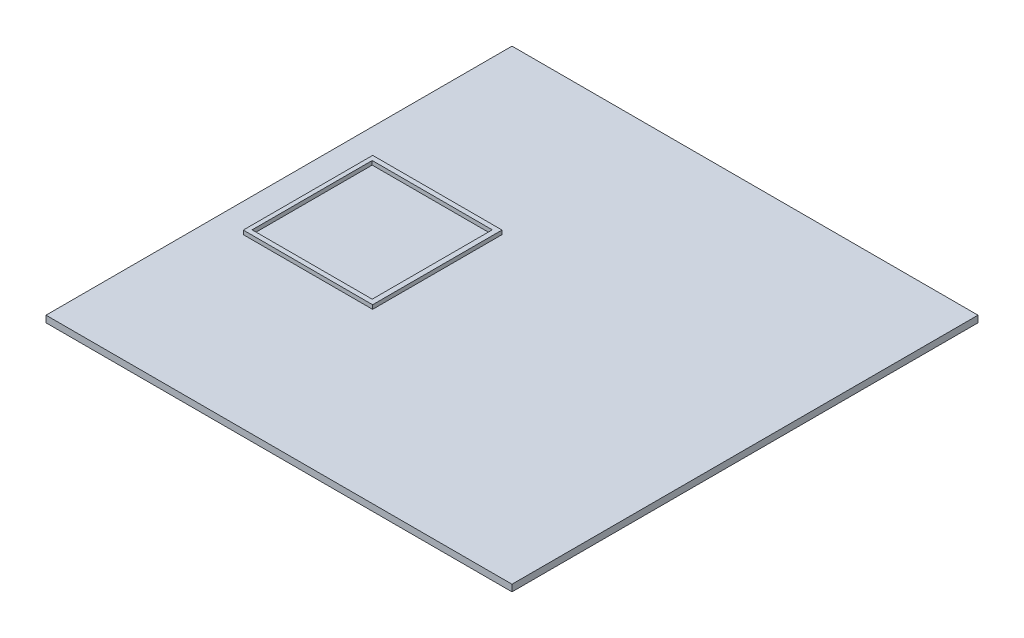
ISO-10303-21;
HEADER;
FILE_DESCRIPTION(('STEP AP214'),'2;1');
FILE_NAME('part.step','',(''),(''),'','','');
FILE_SCHEMA(('AUTOMOTIVE_DESIGN { 1 0 10303 214 1 1 1 1 }'));
ENDSEC;
DATA;
#1=APPLICATION_CONTEXT('core data for automotive mechanical design processes');
#2=APPLICATION_PROTOCOL_DEFINITION('international standard','automotive_design',2000,#1);
#3=PRODUCT_CONTEXT('',#1,'mechanical');
#4=PRODUCT('Part','Part','',(#3));
#5=PRODUCT_RELATED_PRODUCT_CATEGORY('part','',(#4));
#6=PRODUCT_DEFINITION_FORMATION('','',#4);
#7=PRODUCT_DEFINITION_CONTEXT('part definition',#1,'design');
#8=PRODUCT_DEFINITION('design','',#6,#7);
#9=PRODUCT_DEFINITION_SHAPE('','',#8);
#10=(LENGTH_UNIT() NAMED_UNIT(*) SI_UNIT(.MILLI.,.METRE.));
#11=(NAMED_UNIT(*) PLANE_ANGLE_UNIT() SI_UNIT($,.RADIAN.));
#12=(NAMED_UNIT(*) SI_UNIT($,.STERADIAN.) SOLID_ANGLE_UNIT());
#13=UNCERTAINTY_MEASURE_WITH_UNIT(LENGTH_MEASURE(1.E-05),#10,'distance_accuracy_value','');
#14=(GEOMETRIC_REPRESENTATION_CONTEXT(3) GLOBAL_UNCERTAINTY_ASSIGNED_CONTEXT((#13)) GLOBAL_UNIT_ASSIGNED_CONTEXT((#10,
#11,#12)) REPRESENTATION_CONTEXT('',''));
#15=CARTESIAN_POINT('',(0.,0.,0.));
#16=DIRECTION('',(0.,0.,1.));
#17=DIRECTION('',(1.,0.,0.));
#18=AXIS2_PLACEMENT_3D('',#15,#16,#17);
#19=CARTESIAN_POINT('',(0.,5.,0.));
#20=DIRECTION('',(0.,1.,0.));
#21=DIRECTION('',(0.,0.,1.));
#22=AXIS2_PLACEMENT_3D('',#19,#20,#21);
#23=PLANE('',#22);
#24=DIRECTION('',(0.,0.,-1.));
#25=VECTOR('',#24,1.);
#26=CARTESIAN_POINT('',(175.,5.,-175.));
#27=LINE('',#26,#25);
#28=CARTESIAN_POINT('',(175.,5.,175.));
#29=VERTEX_POINT('',#28);
#30=CARTESIAN_POINT('',(175.,5.,-175.));
#31=VERTEX_POINT('',#30);
#32=EDGE_CURVE('E193',#29,#31,#27,.T.);
#33=ORIENTED_EDGE('',*,*,#32,.T.);
#34=DIRECTION('',(-1.,0.,0.));
#35=VECTOR('',#34,1.);
#36=CARTESIAN_POINT('',(-175.,5.,-175.));
#37=LINE('',#36,#35);
#38=CARTESIAN_POINT('',(-175.,5.,-175.));
#39=VERTEX_POINT('',#38);
#40=EDGE_CURVE('E196',#31,#39,#37,.T.);
#41=ORIENTED_EDGE('',*,*,#40,.T.);
#42=DIRECTION('',(0.,0.,1.));
#43=VECTOR('',#42,1.);
#44=CARTESIAN_POINT('',(-175.,5.,-175.));
#45=LINE('',#44,#43);
#46=CARTESIAN_POINT('',(-175.,5.,175.));
#47=VERTEX_POINT('',#46);
#48=EDGE_CURVE('E199',#39,#47,#45,.T.);
#49=ORIENTED_EDGE('',*,*,#48,.T.);
#50=DIRECTION('',(1.,0.,0.));
#51=VECTOR('',#50,1.);
#52=CARTESIAN_POINT('',(-175.,5.,175.));
#53=LINE('',#52,#51);
#54=EDGE_CURVE('E201',#47,#29,#53,.T.);
#55=ORIENTED_EDGE('',*,*,#54,.T.);
#56=EDGE_LOOP('',(#33,#41,#49,#55));
#57=FACE_BOUND('',#56,.T.);
#58=DIRECTION('',(0.,0.,1.));
#59=VECTOR('',#58,1.);
#60=CARTESIAN_POINT('',(-153.264875211768,5.,45.1));
#61=LINE('',#60,#59);
#62=CARTESIAN_POINT('',(-153.264875211768,5.,-48.6228033719769));
#63=VERTEX_POINT('',#62);
#64=CARTESIAN_POINT('',(-153.264875211768,5.,48.5575172830579));
#65=VERTEX_POINT('',#64);
#66=EDGE_CURVE('E178',#63,#65,#61,.T.);
#67=ORIENTED_EDGE('',*,*,#66,.F.);
#68=DIRECTION('',(-1.,0.,0.));
#69=VECTOR('',#68,1.);
#70=CARTESIAN_POINT('',(-153.264875211768,5.,-48.6228033719769));
#71=LINE('',#70,#69);
#72=CARTESIAN_POINT('',(-56.1212085121312,5.,-48.6228033719769));
#73=VERTEX_POINT('',#72);
#74=EDGE_CURVE('E145',#73,#63,#71,.T.);
#75=ORIENTED_EDGE('',*,*,#74,.F.);
#76=DIRECTION('',(0.,0.,-1.));
#77=VECTOR('',#76,1.);
#78=CARTESIAN_POINT('',(-56.1212085121312,5.,-45.1));
#79=LINE('',#78,#77);
#80=CARTESIAN_POINT('',(-56.1212085121312,5.,48.5575172830579));
#81=VERTEX_POINT('',#80);
#82=EDGE_CURVE('E170',#81,#73,#79,.T.);
#83=ORIENTED_EDGE('',*,*,#82,.F.);
#84=DIRECTION('',(1.,0.,0.));
#85=VECTOR('',#84,1.);
#86=CARTESIAN_POINT('',(-59.9,5.,48.5575172830579));
#87=LINE('',#86,#85);
#88=EDGE_CURVE('E180',#65,#81,#87,.T.);
#89=ORIENTED_EDGE('',*,*,#88,.F.);
#90=EDGE_LOOP('',(#67,#75,#83,#89));
#91=FACE_BOUND('',#90,.T.);
#92=ADVANCED_FACE('F37',(#57,#91),#23,.T.);
#93=CARTESIAN_POINT('',(175.,5.,-175.));
#94=DIRECTION('',(-1.,0.,0.));
#95=DIRECTION('',(0.,0.,1.));
#96=AXIS2_PLACEMENT_3D('',#93,#94,#95);
#97=PLANE('',#96);
#98=DIRECTION('',(0.,0.,-1.));
#99=VECTOR('',#98,1.);
#100=CARTESIAN_POINT('',(175.,0.,-175.));
#101=LINE('',#100,#99);
#102=CARTESIAN_POINT('',(175.,0.,175.));
#103=VERTEX_POINT('',#102);
#104=CARTESIAN_POINT('',(175.,0.,-175.));
#105=VERTEX_POINT('',#104);
#106=EDGE_CURVE('E192',#103,#105,#101,.T.);
#107=ORIENTED_EDGE('',*,*,#106,.T.);
#108=DIRECTION('',(0.,-1.,0.));
#109=VECTOR('',#108,1.);
#110=CARTESIAN_POINT('',(175.,5.,-175.));
#111=LINE('',#110,#109);
#112=EDGE_CURVE('E11',#31,#105,#111,.T.);
#113=ORIENTED_EDGE('',*,*,#112,.F.);
#114=ORIENTED_EDGE('',*,*,#32,.F.);
#115=DIRECTION('',(0.,-1.,0.));
#116=VECTOR('',#115,1.);
#117=CARTESIAN_POINT('',(175.,5.,175.));
#118=LINE('',#117,#116);
#119=EDGE_CURVE('E203',#29,#103,#118,.T.);
#120=ORIENTED_EDGE('',*,*,#119,.T.);
#121=EDGE_LOOP('',(#107,#113,#114,#120));
#122=FACE_BOUND('',#121,.T.);
#123=ADVANCED_FACE('F39',(#122),#97,.F.);
#124=CARTESIAN_POINT('',(-175.,5.,-175.));
#125=DIRECTION('',(0.,0.,1.));
#126=DIRECTION('',(1.,0.,0.));
#127=AXIS2_PLACEMENT_3D('',#124,#125,#126);
#128=PLANE('',#127);
#129=DIRECTION('',(-1.,0.,0.));
#130=VECTOR('',#129,1.);
#131=CARTESIAN_POINT('',(-175.,0.,-175.));
#132=LINE('',#131,#130);
#133=CARTESIAN_POINT('',(-175.,0.,-175.));
#134=VERTEX_POINT('',#133);
#135=EDGE_CURVE('E206',#105,#134,#132,.T.);
#136=ORIENTED_EDGE('',*,*,#135,.T.);
#137=DIRECTION('',(0.,-1.,0.));
#138=VECTOR('',#137,1.);
#139=CARTESIAN_POINT('',(-175.,5.,-175.));
#140=LINE('',#139,#138);
#141=EDGE_CURVE('E45',#39,#134,#140,.T.);
#142=ORIENTED_EDGE('',*,*,#141,.F.);
#143=ORIENTED_EDGE('',*,*,#40,.F.);
#144=ORIENTED_EDGE('',*,*,#112,.T.);
#145=EDGE_LOOP('',(#136,#142,#143,#144));
#146=FACE_BOUND('',#145,.T.);
#147=ADVANCED_FACE('F236',(#146),#128,.F.);
#148=CARTESIAN_POINT('',(-175.,5.,-175.));
#149=DIRECTION('',(1.,0.,0.));
#150=DIRECTION('',(0.,0.,-1.));
#151=AXIS2_PLACEMENT_3D('',#148,#149,#150);
#152=PLANE('',#151);
#153=DIRECTION('',(0.,0.,1.));
#154=VECTOR('',#153,1.);
#155=CARTESIAN_POINT('',(-175.,0.,-175.));
#156=LINE('',#155,#154);
#157=CARTESIAN_POINT('',(-175.,0.,175.));
#158=VERTEX_POINT('',#157);
#159=EDGE_CURVE('E208',#134,#158,#156,.T.);
#160=ORIENTED_EDGE('',*,*,#159,.T.);
#161=DIRECTION('',(0.,-1.,0.));
#162=VECTOR('',#161,1.);
#163=CARTESIAN_POINT('',(-175.,5.,175.));
#164=LINE('',#163,#162);
#165=EDGE_CURVE('E213',#47,#158,#164,.T.);
#166=ORIENTED_EDGE('',*,*,#165,.F.);
#167=ORIENTED_EDGE('',*,*,#48,.F.);
#168=ORIENTED_EDGE('',*,*,#141,.T.);
#169=EDGE_LOOP('',(#160,#166,#167,#168));
#170=FACE_BOUND('',#169,.T.);
#171=ADVANCED_FACE('F220',(#170),#152,.F.);
#172=CARTESIAN_POINT('',(-175.,5.,175.));
#173=DIRECTION('',(0.,0.,-1.));
#174=DIRECTION('',(-1.,0.,0.));
#175=AXIS2_PLACEMENT_3D('',#172,#173,#174);
#176=PLANE('',#175);
#177=DIRECTION('',(1.,0.,0.));
#178=VECTOR('',#177,1.);
#179=CARTESIAN_POINT('',(-175.,0.,175.));
#180=LINE('',#179,#178);
#181=EDGE_CURVE('E197',#158,#103,#180,.T.);
#182=ORIENTED_EDGE('',*,*,#181,.T.);
#183=ORIENTED_EDGE('',*,*,#119,.F.);
#184=ORIENTED_EDGE('',*,*,#54,.F.);
#185=ORIENTED_EDGE('',*,*,#165,.T.);
#186=EDGE_LOOP('',(#182,#183,#184,#185));
#187=FACE_BOUND('',#186,.T.);
#188=ADVANCED_FACE('F229',(#187),#176,.F.);
#189=CARTESIAN_POINT('',(0.,0.,0.));
#190=DIRECTION('',(0.,1.,0.));
#191=DIRECTION('',(0.,0.,1.));
#192=AXIS2_PLACEMENT_3D('',#189,#190,#191);
#193=PLANE('',#192);
#194=ORIENTED_EDGE('',*,*,#106,.F.);
#195=ORIENTED_EDGE('',*,*,#181,.F.);
#196=ORIENTED_EDGE('',*,*,#159,.F.);
#197=ORIENTED_EDGE('',*,*,#135,.F.);
#198=EDGE_LOOP('',(#194,#195,#196,#197));
#199=FACE_BOUND('',#198,.T.);
#200=ADVANCED_FACE('F226',(#199),#193,.F.);
#201=CARTESIAN_POINT('',(0.,8.,0.));
#202=DIRECTION('',(0.,-1.,0.));
#203=DIRECTION('',(0.,0.,-1.));
#204=AXIS2_PLACEMENT_3D('',#201,#202,#203);
#205=PLANE('',#204);
#206=DIRECTION('',(-1.,0.,0.));
#207=VECTOR('',#206,1.);
#208=CARTESIAN_POINT('',(-56.1212085121312,8.,-48.6228033719769));
#209=LINE('',#208,#207);
#210=CARTESIAN_POINT('',(-56.1212085121312,8.,-48.6228033719769));
#211=VERTEX_POINT('',#210);
#212=CARTESIAN_POINT('',(-153.264875211768,8.,-48.6228033719769));
#213=VERTEX_POINT('',#212);
#214=EDGE_CURVE('E167',#211,#213,#209,.T.);
#215=ORIENTED_EDGE('',*,*,#214,.T.);
#216=DIRECTION('',(0.,0.,1.));
#217=VECTOR('',#216,1.);
#218=CARTESIAN_POINT('',(-153.264875211768,8.,-45.1));
#219=LINE('',#218,#217);
#220=CARTESIAN_POINT('',(-153.264875211768,8.,48.5575172830579));
#221=VERTEX_POINT('',#220);
#222=EDGE_CURVE('E169',#213,#221,#219,.T.);
#223=ORIENTED_EDGE('',*,*,#222,.T.);
#224=DIRECTION('',(1.,0.,0.));
#225=VECTOR('',#224,1.);
#226=CARTESIAN_POINT('',(-153.264875211768,8.,48.5575172830579));
#227=LINE('',#226,#225);
#228=CARTESIAN_POINT('',(-56.1212085121312,8.,48.5575172830579));
#229=VERTEX_POINT('',#228);
#230=EDGE_CURVE('E172',#221,#229,#227,.T.);
#231=ORIENTED_EDGE('',*,*,#230,.T.);
#232=DIRECTION('',(0.,0.,-1.));
#233=VECTOR('',#232,1.);
#234=CARTESIAN_POINT('',(-56.1212085121312,8.,48.5575172830579));
#235=LINE('',#234,#233);
#236=EDGE_CURVE('E174',#229,#211,#235,.T.);
#237=ORIENTED_EDGE('',*,*,#236,.T.);
#238=EDGE_LOOP('',(#215,#223,#231,#237));
#239=FACE_BOUND('',#238,.T.);
#240=DIRECTION('',(0.,0.,-1.));
#241=VECTOR('',#240,1.);
#242=CARTESIAN_POINT('',(-59.9,8.,-45.1));
#243=LINE('',#242,#241);
#244=CARTESIAN_POINT('',(-59.9,8.,45.1));
#245=VERTEX_POINT('',#244);
#246=CARTESIAN_POINT('',(-59.9,8.,-45.1));
#247=VERTEX_POINT('',#246);
#248=EDGE_CURVE('E128',#245,#247,#243,.T.);
#249=ORIENTED_EDGE('',*,*,#248,.F.);
#250=DIRECTION('',(1.,0.,0.));
#251=VECTOR('',#250,1.);
#252=CARTESIAN_POINT('',(-150.1,8.,45.1));
#253=LINE('',#252,#251);
#254=CARTESIAN_POINT('',(-150.1,8.,45.1));
#255=VERTEX_POINT('',#254);
#256=EDGE_CURVE('E153',#255,#245,#253,.T.);
#257=ORIENTED_EDGE('',*,*,#256,.F.);
#258=DIRECTION('',(0.,0.,1.));
#259=VECTOR('',#258,1.);
#260=CARTESIAN_POINT('',(-150.1,8.,-45.1));
#261=LINE('',#260,#259);
#262=CARTESIAN_POINT('',(-150.1,8.,-45.1));
#263=VERTEX_POINT('',#262);
#264=EDGE_CURVE('E151',#263,#255,#261,.T.);
#265=ORIENTED_EDGE('',*,*,#264,.F.);
#266=DIRECTION('',(-1.,0.,0.));
#267=VECTOR('',#266,1.);
#268=CARTESIAN_POINT('',(-150.1,8.,-45.1));
#269=LINE('',#268,#267);
#270=EDGE_CURVE('E137',#247,#263,#269,.T.);
#271=ORIENTED_EDGE('',*,*,#270,.F.);
#272=EDGE_LOOP('',(#249,#257,#265,#271));
#273=FACE_BOUND('',#272,.T.);
#274=ADVANCED_FACE('F149',(#239,#273),#205,.F.);
#275=CARTESIAN_POINT('',(-153.264875211768,8.,-48.6228033719769));
#276=DIRECTION('',(0.,0.,1.));
#277=DIRECTION('',(1.,0.,0.));
#278=AXIS2_PLACEMENT_3D('',#275,#276,#277);
#279=PLANE('',#278);
#280=ORIENTED_EDGE('',*,*,#74,.T.);
#281=DIRECTION('',(0.,-1.,0.));
#282=VECTOR('',#281,1.);
#283=CARTESIAN_POINT('',(-153.264875211768,8.,-48.6228033719769));
#284=LINE('',#283,#282);
#285=EDGE_CURVE('E189',#213,#63,#284,.T.);
#286=ORIENTED_EDGE('',*,*,#285,.F.);
#287=ORIENTED_EDGE('',*,*,#214,.F.);
#288=DIRECTION('',(0.,-1.,0.));
#289=VECTOR('',#288,1.);
#290=CARTESIAN_POINT('',(-56.1212085121312,8.,-48.6228033719769));
#291=LINE('',#290,#289);
#292=EDGE_CURVE('E176',#211,#73,#291,.T.);
#293=ORIENTED_EDGE('',*,*,#292,.T.);
#294=EDGE_LOOP('',(#280,#286,#287,#293));
#295=FACE_BOUND('',#294,.T.);
#296=ADVANCED_FACE('F272',(#295),#279,.F.);
#297=CARTESIAN_POINT('',(-153.264875211768,8.,45.1));
#298=DIRECTION('',(1.,0.,0.));
#299=DIRECTION('',(0.,0.,-1.));
#300=AXIS2_PLACEMENT_3D('',#297,#298,#299);
#301=PLANE('',#300);
#302=ORIENTED_EDGE('',*,*,#66,.T.);
#303=DIRECTION('',(0.,-1.,0.));
#304=VECTOR('',#303,1.);
#305=CARTESIAN_POINT('',(-153.264875211768,8.,48.5575172830579));
#306=LINE('',#305,#304);
#307=EDGE_CURVE('E186',#221,#65,#306,.T.);
#308=ORIENTED_EDGE('',*,*,#307,.F.);
#309=ORIENTED_EDGE('',*,*,#222,.F.);
#310=ORIENTED_EDGE('',*,*,#285,.T.);
#311=EDGE_LOOP('',(#302,#308,#309,#310));
#312=FACE_BOUND('',#311,.T.);
#313=ADVANCED_FACE('F279',(#312),#301,.F.);
#314=CARTESIAN_POINT('',(-59.9,8.,48.5575172830579));
#315=DIRECTION('',(0.,0.,-1.));
#316=DIRECTION('',(-1.,0.,0.));
#317=AXIS2_PLACEMENT_3D('',#314,#315,#316);
#318=PLANE('',#317);
#319=ORIENTED_EDGE('',*,*,#88,.T.);
#320=DIRECTION('',(0.,-1.,0.));
#321=VECTOR('',#320,1.);
#322=CARTESIAN_POINT('',(-56.1212085121312,8.,48.5575172830579));
#323=LINE('',#322,#321);
#324=EDGE_CURVE('E52',#229,#81,#323,.T.);
#325=ORIENTED_EDGE('',*,*,#324,.F.);
#326=ORIENTED_EDGE('',*,*,#230,.F.);
#327=ORIENTED_EDGE('',*,*,#307,.T.);
#328=EDGE_LOOP('',(#319,#325,#326,#327));
#329=FACE_BOUND('',#328,.T.);
#330=ADVANCED_FACE('F276',(#329),#318,.F.);
#331=CARTESIAN_POINT('',(-56.1212085121312,8.,-45.1));
#332=DIRECTION('',(-1.,0.,0.));
#333=DIRECTION('',(0.,0.,1.));
#334=AXIS2_PLACEMENT_3D('',#331,#332,#333);
#335=PLANE('',#334);
#336=ORIENTED_EDGE('',*,*,#82,.T.);
#337=ORIENTED_EDGE('',*,*,#292,.F.);
#338=ORIENTED_EDGE('',*,*,#236,.F.);
#339=ORIENTED_EDGE('',*,*,#324,.T.);
#340=EDGE_LOOP('',(#336,#337,#338,#339));
#341=FACE_BOUND('',#340,.T.);
#342=ADVANCED_FACE('F269',(#341),#335,.F.);
#343=CARTESIAN_POINT('',(-59.9,8.,-45.1));
#344=DIRECTION('',(-1.,0.,0.));
#345=DIRECTION('',(0.,0.,1.));
#346=AXIS2_PLACEMENT_3D('',#343,#344,#345);
#347=PLANE('',#346);
#348=DIRECTION('',(0.,0.,-1.));
#349=VECTOR('',#348,1.);
#350=CARTESIAN_POINT('',(-59.9,5.,-45.1));
#351=LINE('',#350,#349);
#352=CARTESIAN_POINT('',(-59.9,5.,45.1));
#353=VERTEX_POINT('',#352);
#354=CARTESIAN_POINT('',(-59.9,5.,-45.1));
#355=VERTEX_POINT('',#354);
#356=EDGE_CURVE('E60',#353,#355,#351,.T.);
#357=ORIENTED_EDGE('',*,*,#356,.F.);
#358=DIRECTION('',(0.,-1.,0.));
#359=VECTOR('',#358,1.);
#360=CARTESIAN_POINT('',(-59.9,8.,45.1));
#361=LINE('',#360,#359);
#362=EDGE_CURVE('E133',#245,#353,#361,.T.);
#363=ORIENTED_EDGE('',*,*,#362,.F.);
#364=ORIENTED_EDGE('',*,*,#248,.T.);
#365=DIRECTION('',(0.,-1.,0.));
#366=VECTOR('',#365,1.);
#367=CARTESIAN_POINT('',(-59.9,8.,-45.1));
#368=LINE('',#367,#366);
#369=EDGE_CURVE('E131',#247,#355,#368,.T.);
#370=ORIENTED_EDGE('',*,*,#369,.T.);
#371=EDGE_LOOP('',(#357,#363,#364,#370));
#372=FACE_BOUND('',#371,.T.);
#373=ADVANCED_FACE('F130',(#372),#347,.T.);
#374=CARTESIAN_POINT('',(-150.1,8.,-45.1));
#375=DIRECTION('',(0.,0.,1.));
#376=DIRECTION('',(1.,0.,0.));
#377=AXIS2_PLACEMENT_3D('',#374,#375,#376);
#378=PLANE('',#377);
#379=DIRECTION('',(-1.,0.,0.));
#380=VECTOR('',#379,1.);
#381=CARTESIAN_POINT('',(-150.1,5.,-45.1));
#382=LINE('',#381,#380);
#383=CARTESIAN_POINT('',(-150.1,5.,-45.1));
#384=VERTEX_POINT('',#383);
#385=EDGE_CURVE('E144',#355,#384,#382,.T.);
#386=ORIENTED_EDGE('',*,*,#385,.F.);
#387=ORIENTED_EDGE('',*,*,#369,.F.);
#388=ORIENTED_EDGE('',*,*,#270,.T.);
#389=DIRECTION('',(0.,-1.,0.));
#390=VECTOR('',#389,1.);
#391=CARTESIAN_POINT('',(-150.1,8.,-45.1));
#392=LINE('',#391,#390);
#393=EDGE_CURVE('E146',#263,#384,#392,.T.);
#394=ORIENTED_EDGE('',*,*,#393,.T.);
#395=EDGE_LOOP('',(#386,#387,#388,#394));
#396=FACE_BOUND('',#395,.T.);
#397=ADVANCED_FACE('F141',(#396),#378,.T.);
#398=CARTESIAN_POINT('',(-150.1,8.,-45.1));
#399=DIRECTION('',(1.,0.,0.));
#400=DIRECTION('',(0.,0.,-1.));
#401=AXIS2_PLACEMENT_3D('',#398,#399,#400);
#402=PLANE('',#401);
#403=DIRECTION('',(0.,0.,1.));
#404=VECTOR('',#403,1.);
#405=CARTESIAN_POINT('',(-150.1,5.,-45.1));
#406=LINE('',#405,#404);
#407=CARTESIAN_POINT('',(-150.1,5.,45.1));
#408=VERTEX_POINT('',#407);
#409=EDGE_CURVE('E159',#384,#408,#406,.T.);
#410=ORIENTED_EDGE('',*,*,#409,.F.);
#411=ORIENTED_EDGE('',*,*,#393,.F.);
#412=ORIENTED_EDGE('',*,*,#264,.T.);
#413=DIRECTION('',(0.,-1.,0.));
#414=VECTOR('',#413,1.);
#415=CARTESIAN_POINT('',(-150.1,8.,45.1));
#416=LINE('',#415,#414);
#417=EDGE_CURVE('E163',#255,#408,#416,.T.);
#418=ORIENTED_EDGE('',*,*,#417,.T.);
#419=EDGE_LOOP('',(#410,#411,#412,#418));
#420=FACE_BOUND('',#419,.T.);
#421=ADVANCED_FACE('F255',(#420),#402,.T.);
#422=CARTESIAN_POINT('',(-150.1,8.,45.1));
#423=DIRECTION('',(0.,0.,-1.));
#424=DIRECTION('',(-1.,0.,0.));
#425=AXIS2_PLACEMENT_3D('',#422,#423,#424);
#426=PLANE('',#425);
#427=DIRECTION('',(1.,0.,0.));
#428=VECTOR('',#427,1.);
#429=CARTESIAN_POINT('',(-150.1,5.,45.1));
#430=LINE('',#429,#428);
#431=EDGE_CURVE('E138',#408,#353,#430,.T.);
#432=ORIENTED_EDGE('',*,*,#431,.F.);
#433=ORIENTED_EDGE('',*,*,#417,.F.);
#434=ORIENTED_EDGE('',*,*,#256,.T.);
#435=ORIENTED_EDGE('',*,*,#362,.T.);
#436=EDGE_LOOP('',(#432,#433,#434,#435));
#437=FACE_BOUND('',#436,.T.);
#438=ADVANCED_FACE('F251',(#437),#426,.T.);
#439=ORIENTED_EDGE('',*,*,#356,.T.);
#440=ORIENTED_EDGE('',*,*,#385,.T.);
#441=ORIENTED_EDGE('',*,*,#409,.T.);
#442=ORIENTED_EDGE('',*,*,#431,.T.);
#443=EDGE_LOOP('',(#439,#440,#441,#442));
#444=FACE_BOUND('',#443,.T.);
#445=ADVANCED_FACE('F245',(#444),#23,.T.);
#446=CLOSED_SHELL('',(#92,#123,#147,#171,#188,#200,#274,#296,#313,#330,#342,#373,#397,#421,#438,#445));
#447=MANIFOLD_SOLID_BREP('B2',#446);
#448=ADVANCED_BREP_SHAPE_REPRESENTATION('',(#18,#447),#14);
#449=SHAPE_DEFINITION_REPRESENTATION(#9,#448);
ENDSEC;
END-ISO-10303-21;
